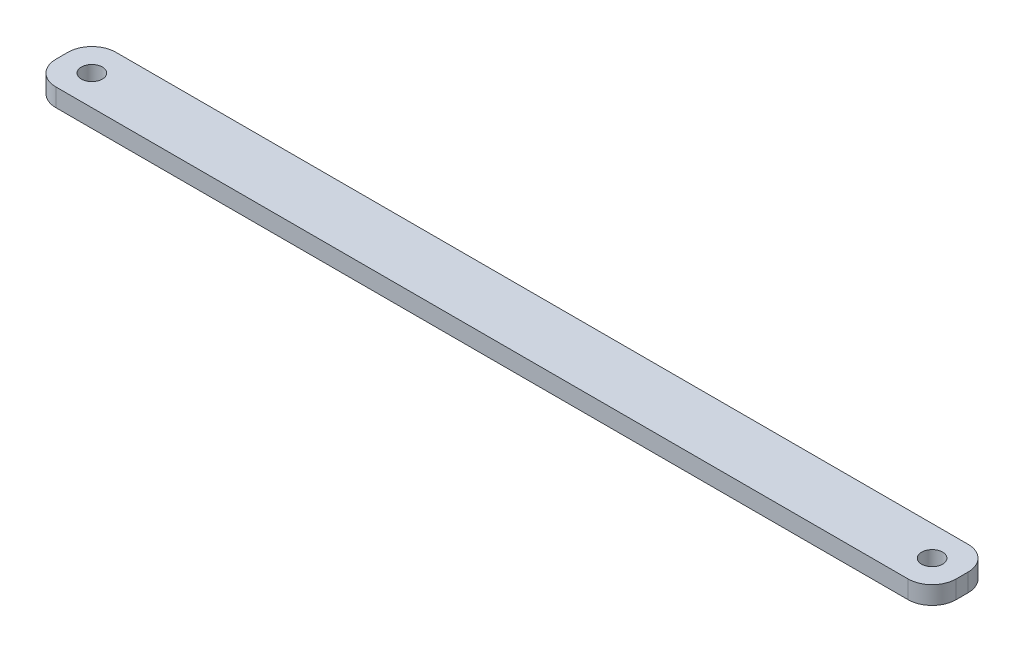
ISO-10303-21;
HEADER;
FILE_DESCRIPTION(('STEP AP214'),'2;1');
FILE_NAME('part.step','',(''),(''),'','','');
FILE_SCHEMA(('AUTOMOTIVE_DESIGN { 1 0 10303 214 1 1 1 1 }'));
ENDSEC;
DATA;
#1=APPLICATION_CONTEXT('core data for automotive mechanical design processes');
#2=APPLICATION_PROTOCOL_DEFINITION('international standard','automotive_design',2000,#1);
#3=PRODUCT_CONTEXT('',#1,'mechanical');
#4=PRODUCT('Part','Part','',(#3));
#5=PRODUCT_RELATED_PRODUCT_CATEGORY('part','',(#4));
#6=PRODUCT_DEFINITION_FORMATION('','',#4);
#7=PRODUCT_DEFINITION_CONTEXT('part definition',#1,'design');
#8=PRODUCT_DEFINITION('design','',#6,#7);
#9=PRODUCT_DEFINITION_SHAPE('','',#8);
#10=(LENGTH_UNIT() NAMED_UNIT(*) SI_UNIT(.MILLI.,.METRE.));
#11=(NAMED_UNIT(*) PLANE_ANGLE_UNIT() SI_UNIT($,.RADIAN.));
#12=(NAMED_UNIT(*) SI_UNIT($,.STERADIAN.) SOLID_ANGLE_UNIT());
#13=UNCERTAINTY_MEASURE_WITH_UNIT(LENGTH_MEASURE(1.E-05),#10,'distance_accuracy_value','');
#14=(GEOMETRIC_REPRESENTATION_CONTEXT(3) GLOBAL_UNCERTAINTY_ASSIGNED_CONTEXT((#13)) GLOBAL_UNIT_ASSIGNED_CONTEXT((#10,
#11,#12)) REPRESENTATION_CONTEXT('',''));
#15=CARTESIAN_POINT('',(0.,0.,0.));
#16=DIRECTION('',(0.,0.,1.));
#17=DIRECTION('',(1.,0.,0.));
#18=AXIS2_PLACEMENT_3D('',#15,#16,#17);
#19=CARTESIAN_POINT('',(75.,3.,-5.));
#20=DIRECTION('',(-1.,0.,0.));
#21=DIRECTION('',(0.,0.,1.));
#22=AXIS2_PLACEMENT_3D('',#19,#20,#21);
#23=PLANE('',#22);
#24=DIRECTION('',(0.,0.,-1.));
#25=VECTOR('',#24,1.);
#26=CARTESIAN_POINT('',(75.,0.,-5.));
#27=LINE('',#26,#25);
#28=CARTESIAN_POINT('',(75.,0.,1.));
#29=VERTEX_POINT('',#28);
#30=CARTESIAN_POINT('',(75.,0.,-1.));
#31=VERTEX_POINT('',#30);
#32=EDGE_CURVE('E144',#29,#31,#27,.T.);
#33=ORIENTED_EDGE('',*,*,#32,.T.);
#34=DIRECTION('',(0.,-1.,0.));
#35=VECTOR('',#34,1.);
#36=CARTESIAN_POINT('',(75.,3.,-1.));
#37=LINE('',#36,#35);
#38=CARTESIAN_POINT('',(75.,3.,-1.));
#39=VERTEX_POINT('',#38);
#40=EDGE_CURVE('E11',#31,#39,#37,.F.);
#41=ORIENTED_EDGE('',*,*,#40,.T.);
#42=DIRECTION('',(0.,0.,-1.));
#43=VECTOR('',#42,1.);
#44=CARTESIAN_POINT('',(75.,3.,-5.));
#45=LINE('',#44,#43);
#46=CARTESIAN_POINT('',(75.,3.,1.));
#47=VERTEX_POINT('',#46);
#48=EDGE_CURVE('E142',#47,#39,#45,.T.);
#49=ORIENTED_EDGE('',*,*,#48,.F.);
#50=DIRECTION('',(0.,-1.,0.));
#51=VECTOR('',#50,1.);
#52=CARTESIAN_POINT('',(75.,3.,1.));
#53=LINE('',#52,#51);
#54=EDGE_CURVE('E51',#47,#29,#53,.T.);
#55=ORIENTED_EDGE('',*,*,#54,.T.);
#56=EDGE_LOOP('',(#33,#41,#49,#55));
#57=FACE_BOUND('',#56,.T.);
#58=ADVANCED_FACE('F42',(#57),#23,.F.);
#59=CARTESIAN_POINT('',(-75.,3.,-5.));
#60=DIRECTION('',(0.,0.,1.));
#61=DIRECTION('',(1.,0.,0.));
#62=AXIS2_PLACEMENT_3D('',#59,#60,#61);
#63=PLANE('',#62);
#64=DIRECTION('',(-1.,0.,0.));
#65=VECTOR('',#64,1.);
#66=CARTESIAN_POINT('',(-75.,0.,-5.));
#67=LINE('',#66,#65);
#68=CARTESIAN_POINT('',(71.,0.,-5.));
#69=VERTEX_POINT('',#68);
#70=CARTESIAN_POINT('',(-71.,0.,-5.));
#71=VERTEX_POINT('',#70);
#72=EDGE_CURVE('E138',#69,#71,#67,.T.);
#73=ORIENTED_EDGE('',*,*,#72,.T.);
#74=DIRECTION('',(0.,-1.,0.));
#75=VECTOR('',#74,1.);
#76=CARTESIAN_POINT('',(-71.,3.,-5.));
#77=LINE('',#76,#75);
#78=CARTESIAN_POINT('',(-71.,3.,-5.));
#79=VERTEX_POINT('',#78);
#80=EDGE_CURVE('E114',#71,#79,#77,.F.);
#81=ORIENTED_EDGE('',*,*,#80,.T.);
#82=DIRECTION('',(-1.,0.,0.));
#83=VECTOR('',#82,1.);
#84=CARTESIAN_POINT('',(-75.,3.,-5.));
#85=LINE('',#84,#83);
#86=CARTESIAN_POINT('',(71.,3.,-5.));
#87=VERTEX_POINT('',#86);
#88=EDGE_CURVE('E201',#87,#79,#85,.T.);
#89=ORIENTED_EDGE('',*,*,#88,.F.);
#90=DIRECTION('',(0.,-1.,0.));
#91=VECTOR('',#90,1.);
#92=CARTESIAN_POINT('',(71.,3.,-5.));
#93=LINE('',#92,#91);
#94=EDGE_CURVE('E120',#87,#69,#93,.T.);
#95=ORIENTED_EDGE('',*,*,#94,.T.);
#96=EDGE_LOOP('',(#73,#81,#89,#95));
#97=FACE_BOUND('',#96,.T.);
#98=ADVANCED_FACE('F231',(#97),#63,.F.);
#99=CARTESIAN_POINT('',(-75.,3.,-5.));
#100=DIRECTION('',(1.,0.,0.));
#101=DIRECTION('',(0.,0.,-1.));
#102=AXIS2_PLACEMENT_3D('',#99,#100,#101);
#103=PLANE('',#102);
#104=DIRECTION('',(0.,0.,1.));
#105=VECTOR('',#104,1.);
#106=CARTESIAN_POINT('',(-75.,3.,-5.));
#107=LINE('',#106,#105);
#108=CARTESIAN_POINT('',(-75.,3.,-1.));
#109=VERTEX_POINT('',#108);
#110=CARTESIAN_POINT('',(-75.,3.,1.));
#111=VERTEX_POINT('',#110);
#112=EDGE_CURVE('E129',#109,#111,#107,.T.);
#113=ORIENTED_EDGE('',*,*,#112,.F.);
#114=DIRECTION('',(0.,-1.,0.));
#115=VECTOR('',#114,1.);
#116=CARTESIAN_POINT('',(-75.,3.,-1.));
#117=LINE('',#116,#115);
#118=CARTESIAN_POINT('',(-75.,0.,-1.));
#119=VERTEX_POINT('',#118);
#120=EDGE_CURVE('E113',#109,#119,#117,.T.);
#121=ORIENTED_EDGE('',*,*,#120,.T.);
#122=DIRECTION('',(0.,0.,1.));
#123=VECTOR('',#122,1.);
#124=CARTESIAN_POINT('',(-75.,0.,-5.));
#125=LINE('',#124,#123);
#126=CARTESIAN_POINT('',(-75.,0.,1.));
#127=VERTEX_POINT('',#126);
#128=EDGE_CURVE('E127',#119,#127,#125,.T.);
#129=ORIENTED_EDGE('',*,*,#128,.T.);
#130=DIRECTION('',(0.,-1.,0.));
#131=VECTOR('',#130,1.);
#132=CARTESIAN_POINT('',(-75.,3.,1.));
#133=LINE('',#132,#131);
#134=EDGE_CURVE('E132',#127,#111,#133,.F.);
#135=ORIENTED_EDGE('',*,*,#134,.T.);
#136=EDGE_LOOP('',(#113,#121,#129,#135));
#137=FACE_BOUND('',#136,.T.);
#138=ADVANCED_FACE('F126',(#137),#103,.F.);
#139=CARTESIAN_POINT('',(-75.,3.,5.));
#140=DIRECTION('',(0.,0.,-1.));
#141=DIRECTION('',(-1.,0.,0.));
#142=AXIS2_PLACEMENT_3D('',#139,#140,#141);
#143=PLANE('',#142);
#144=DIRECTION('',(1.,0.,0.));
#145=VECTOR('',#144,1.);
#146=CARTESIAN_POINT('',(-75.,3.,5.));
#147=LINE('',#146,#145);
#148=CARTESIAN_POINT('',(-71.,3.,5.));
#149=VERTEX_POINT('',#148);
#150=CARTESIAN_POINT('',(71.,3.,5.));
#151=VERTEX_POINT('',#150);
#152=EDGE_CURVE('E149',#149,#151,#147,.T.);
#153=ORIENTED_EDGE('',*,*,#152,.F.);
#154=DIRECTION('',(0.,-1.,0.));
#155=VECTOR('',#154,1.);
#156=CARTESIAN_POINT('',(-71.,3.,5.));
#157=LINE('',#156,#155);
#158=CARTESIAN_POINT('',(-71.,0.,5.));
#159=VERTEX_POINT('',#158);
#160=EDGE_CURVE('E176',#149,#159,#157,.T.);
#161=ORIENTED_EDGE('',*,*,#160,.T.);
#162=DIRECTION('',(1.,0.,0.));
#163=VECTOR('',#162,1.);
#164=CARTESIAN_POINT('',(-75.,0.,5.));
#165=LINE('',#164,#163);
#166=CARTESIAN_POINT('',(71.,0.,5.));
#167=VERTEX_POINT('',#166);
#168=EDGE_CURVE('E137',#159,#167,#165,.T.);
#169=ORIENTED_EDGE('',*,*,#168,.T.);
#170=DIRECTION('',(0.,-1.,0.));
#171=VECTOR('',#170,1.);
#172=CARTESIAN_POINT('',(71.,3.,5.));
#173=LINE('',#172,#171);
#174=EDGE_CURVE('E58',#167,#151,#173,.F.);
#175=ORIENTED_EDGE('',*,*,#174,.T.);
#176=EDGE_LOOP('',(#153,#161,#169,#175));
#177=FACE_BOUND('',#176,.T.);
#178=ADVANCED_FACE('F224',(#177),#143,.F.);
#179=CARTESIAN_POINT('',(0.,3.,0.));
#180=DIRECTION('',(0.,1.,0.));
#181=DIRECTION('',(0.,0.,1.));
#182=AXIS2_PLACEMENT_3D('',#179,#180,#181);
#183=PLANE('',#182);
#184=CARTESIAN_POINT('',(-70.,3.,0.));
#185=DIRECTION('',(0.,1.,0.));
#186=DIRECTION('',(0.,0.,1.));
#187=AXIS2_PLACEMENT_3D('',#184,#185,#186);
#188=CIRCLE('',#187,1.75);
#189=CARTESIAN_POINT('',(-70.,3.,1.75));
#190=VERTEX_POINT('',#189);
#191=EDGE_CURVE('E194',#190,#190,#188,.T.);
#192=ORIENTED_EDGE('',*,*,#191,.F.);
#193=EDGE_LOOP('',(#192));
#194=FACE_BOUND('',#193,.T.);
#195=CARTESIAN_POINT('',(70.,3.,0.));
#196=DIRECTION('',(0.,1.,0.));
#197=DIRECTION('',(0.,0.,1.));
#198=AXIS2_PLACEMENT_3D('',#195,#196,#197);
#199=CIRCLE('',#198,1.75);
#200=CARTESIAN_POINT('',(70.,3.,1.74999999999997));
#201=VERTEX_POINT('',#200);
#202=EDGE_CURVE('E211',#201,#201,#199,.T.);
#203=ORIENTED_EDGE('',*,*,#202,.F.);
#204=EDGE_LOOP('',(#203));
#205=FACE_BOUND('',#204,.T.);
#206=ORIENTED_EDGE('',*,*,#88,.T.);
#207=CARTESIAN_POINT('',(-71.,3.,-1.));
#208=DIRECTION('',(0.,1.,0.));
#209=DIRECTION('',(0.,0.,1.));
#210=AXIS2_PLACEMENT_3D('',#207,#208,#209);
#211=CIRCLE('',#210,4.);
#212=EDGE_CURVE('E171',#79,#109,#211,.T.);
#213=ORIENTED_EDGE('',*,*,#212,.T.);
#214=ORIENTED_EDGE('',*,*,#112,.T.);
#215=CARTESIAN_POINT('',(-71.,3.,1.));
#216=DIRECTION('',(0.,1.,0.));
#217=DIRECTION('',(0.,0.,1.));
#218=AXIS2_PLACEMENT_3D('',#215,#216,#217);
#219=CIRCLE('',#218,4.);
#220=EDGE_CURVE('E65',#111,#149,#219,.T.);
#221=ORIENTED_EDGE('',*,*,#220,.T.);
#222=ORIENTED_EDGE('',*,*,#152,.T.);
#223=CARTESIAN_POINT('',(71.,3.,1.));
#224=DIRECTION('',(0.,1.,0.));
#225=DIRECTION('',(0.,0.,1.));
#226=AXIS2_PLACEMENT_3D('',#223,#224,#225);
#227=CIRCLE('',#226,4.);
#228=EDGE_CURVE('E163',#151,#47,#227,.T.);
#229=ORIENTED_EDGE('',*,*,#228,.T.);
#230=ORIENTED_EDGE('',*,*,#48,.T.);
#231=CARTESIAN_POINT('',(71.,3.,-1.));
#232=DIRECTION('',(0.,1.,0.));
#233=DIRECTION('',(0.,0.,1.));
#234=AXIS2_PLACEMENT_3D('',#231,#232,#233);
#235=CIRCLE('',#234,4.);
#236=EDGE_CURVE('E166',#39,#87,#235,.T.);
#237=ORIENTED_EDGE('',*,*,#236,.T.);
#238=EDGE_LOOP('',(#206,#213,#214,#221,#222,#229,#230,#237));
#239=FACE_BOUND('',#238,.T.);
#240=ADVANCED_FACE('F221',(#194,#205,#239),#183,.T.);
#241=CARTESIAN_POINT('',(0.,0.,0.));
#242=DIRECTION('',(0.,1.,0.));
#243=DIRECTION('',(0.,0.,1.));
#244=AXIS2_PLACEMENT_3D('',#241,#242,#243);
#245=PLANE('',#244);
#246=CARTESIAN_POINT('',(-70.,0.,0.));
#247=DIRECTION('',(0.,1.,0.));
#248=DIRECTION('',(0.,0.,1.));
#249=AXIS2_PLACEMENT_3D('',#246,#247,#248);
#250=CIRCLE('',#249,1.75);
#251=CARTESIAN_POINT('',(-70.,0.,1.75));
#252=VERTEX_POINT('',#251);
#253=EDGE_CURVE('E191',#252,#252,#250,.T.);
#254=ORIENTED_EDGE('',*,*,#253,.T.);
#255=EDGE_LOOP('',(#254));
#256=FACE_BOUND('',#255,.T.);
#257=CARTESIAN_POINT('',(70.,0.,0.));
#258=DIRECTION('',(0.,1.,0.));
#259=DIRECTION('',(0.,0.,1.));
#260=AXIS2_PLACEMENT_3D('',#257,#258,#259);
#261=CIRCLE('',#260,1.75);
#262=CARTESIAN_POINT('',(70.,0.,1.74999999999997));
#263=VERTEX_POINT('',#262);
#264=EDGE_CURVE('E207',#263,#263,#261,.T.);
#265=ORIENTED_EDGE('',*,*,#264,.T.);
#266=EDGE_LOOP('',(#265));
#267=FACE_BOUND('',#266,.T.);
#268=ORIENTED_EDGE('',*,*,#128,.F.);
#269=CARTESIAN_POINT('',(-71.,0.,-1.));
#270=DIRECTION('',(0.,1.,0.));
#271=DIRECTION('',(0.,0.,1.));
#272=AXIS2_PLACEMENT_3D('',#269,#270,#271);
#273=CIRCLE('',#272,4.);
#274=EDGE_CURVE('E109',#119,#71,#273,.F.);
#275=ORIENTED_EDGE('',*,*,#274,.T.);
#276=ORIENTED_EDGE('',*,*,#72,.F.);
#277=CARTESIAN_POINT('',(71.,0.,-1.));
#278=DIRECTION('',(0.,1.,0.));
#279=DIRECTION('',(0.,0.,1.));
#280=AXIS2_PLACEMENT_3D('',#277,#278,#279);
#281=CIRCLE('',#280,4.);
#282=EDGE_CURVE('E153',#69,#31,#281,.F.);
#283=ORIENTED_EDGE('',*,*,#282,.T.);
#284=ORIENTED_EDGE('',*,*,#32,.F.);
#285=CARTESIAN_POINT('',(71.,0.,1.));
#286=DIRECTION('',(0.,1.,0.));
#287=DIRECTION('',(0.,0.,1.));
#288=AXIS2_PLACEMENT_3D('',#285,#286,#287);
#289=CIRCLE('',#288,4.);
#290=EDGE_CURVE('E131',#29,#167,#289,.F.);
#291=ORIENTED_EDGE('',*,*,#290,.T.);
#292=ORIENTED_EDGE('',*,*,#168,.F.);
#293=CARTESIAN_POINT('',(-71.,0.,1.));
#294=DIRECTION('',(0.,1.,0.));
#295=DIRECTION('',(0.,0.,1.));
#296=AXIS2_PLACEMENT_3D('',#293,#294,#295);
#297=CIRCLE('',#296,4.);
#298=EDGE_CURVE('E121',#159,#127,#297,.F.);
#299=ORIENTED_EDGE('',*,*,#298,.T.);
#300=EDGE_LOOP('',(#268,#275,#276,#283,#284,#291,#292,#299));
#301=FACE_BOUND('',#300,.T.);
#302=ADVANCED_FACE('F134',(#256,#267,#301),#245,.F.);
#303=CARTESIAN_POINT('',(-71.,3.,-1.));
#304=DIRECTION('',(0.,-1.,0.));
#305=DIRECTION('',(0.,0.,-1.));
#306=AXIS2_PLACEMENT_3D('',#303,#304,#305);
#307=CYLINDRICAL_SURFACE('',#306,4.);
#308=ORIENTED_EDGE('',*,*,#212,.F.);
#309=ORIENTED_EDGE('',*,*,#80,.F.);
#310=ORIENTED_EDGE('',*,*,#274,.F.);
#311=ORIENTED_EDGE('',*,*,#120,.F.);
#312=EDGE_LOOP('',(#308,#309,#310,#311));
#313=FACE_BOUND('',#312,.T.);
#314=ADVANCED_FACE('F112',(#313),#307,.T.);
#315=CARTESIAN_POINT('',(-71.,3.,1.));
#316=DIRECTION('',(0.,-1.,0.));
#317=DIRECTION('',(0.,0.,-1.));
#318=AXIS2_PLACEMENT_3D('',#315,#316,#317);
#319=CYLINDRICAL_SURFACE('',#318,4.);
#320=ORIENTED_EDGE('',*,*,#220,.F.);
#321=ORIENTED_EDGE('',*,*,#134,.F.);
#322=ORIENTED_EDGE('',*,*,#298,.F.);
#323=ORIENTED_EDGE('',*,*,#160,.F.);
#324=EDGE_LOOP('',(#320,#321,#322,#323));
#325=FACE_BOUND('',#324,.T.);
#326=ADVANCED_FACE('F242',(#325),#319,.T.);
#327=CARTESIAN_POINT('',(71.,3.,-1.));
#328=DIRECTION('',(0.,-1.,0.));
#329=DIRECTION('',(0.,0.,-1.));
#330=AXIS2_PLACEMENT_3D('',#327,#328,#329);
#331=CYLINDRICAL_SURFACE('',#330,4.);
#332=ORIENTED_EDGE('',*,*,#236,.F.);
#333=ORIENTED_EDGE('',*,*,#40,.F.);
#334=ORIENTED_EDGE('',*,*,#282,.F.);
#335=ORIENTED_EDGE('',*,*,#94,.F.);
#336=EDGE_LOOP('',(#332,#333,#334,#335));
#337=FACE_BOUND('',#336,.T.);
#338=ADVANCED_FACE('F233',(#337),#331,.T.);
#339=CARTESIAN_POINT('',(71.,3.,1.));
#340=DIRECTION('',(0.,-1.,0.));
#341=DIRECTION('',(0.,0.,-1.));
#342=AXIS2_PLACEMENT_3D('',#339,#340,#341);
#343=CYLINDRICAL_SURFACE('',#342,4.);
#344=ORIENTED_EDGE('',*,*,#228,.F.);
#345=ORIENTED_EDGE('',*,*,#174,.F.);
#346=ORIENTED_EDGE('',*,*,#290,.F.);
#347=ORIENTED_EDGE('',*,*,#54,.F.);
#348=EDGE_LOOP('',(#344,#345,#346,#347));
#349=FACE_BOUND('',#348,.T.);
#350=ADVANCED_FACE('F44',(#349),#343,.T.);
#351=CARTESIAN_POINT('',(70.,0.,0.));
#352=DIRECTION('',(0.,1.,0.));
#353=DIRECTION('',(0.,0.,1.));
#354=AXIS2_PLACEMENT_3D('',#351,#352,#353);
#355=CYLINDRICAL_SURFACE('',#354,1.75);
#356=ORIENTED_EDGE('',*,*,#264,.F.);
#357=EDGE_LOOP('',(#356));
#358=FACE_BOUND('',#357,.T.);
#359=ORIENTED_EDGE('',*,*,#202,.T.);
#360=EDGE_LOOP('',(#359));
#361=FACE_BOUND('',#360,.T.);
#362=ADVANCED_FACE('F235',(#358,#361),#355,.F.);
#363=CARTESIAN_POINT('',(-70.,0.,0.));
#364=DIRECTION('',(0.,1.,0.));
#365=DIRECTION('',(0.,0.,1.));
#366=AXIS2_PLACEMENT_3D('',#363,#364,#365);
#367=CYLINDRICAL_SURFACE('',#366,1.75);
#368=ORIENTED_EDGE('',*,*,#253,.F.);
#369=EDGE_LOOP('',(#368));
#370=FACE_BOUND('',#369,.T.);
#371=ORIENTED_EDGE('',*,*,#191,.T.);
#372=EDGE_LOOP('',(#371));
#373=FACE_BOUND('',#372,.T.);
#374=ADVANCED_FACE('F219',(#370,#373),#367,.F.);
#375=CLOSED_SHELL('',(#58,#98,#138,#178,#240,#302,#314,#326,#338,#350,#362,#374));
#376=MANIFOLD_SOLID_BREP('B2',#375);
#377=ADVANCED_BREP_SHAPE_REPRESENTATION('',(#18,#376),#14);
#378=SHAPE_DEFINITION_REPRESENTATION(#9,#377);
ENDSEC;
END-ISO-10303-21;
